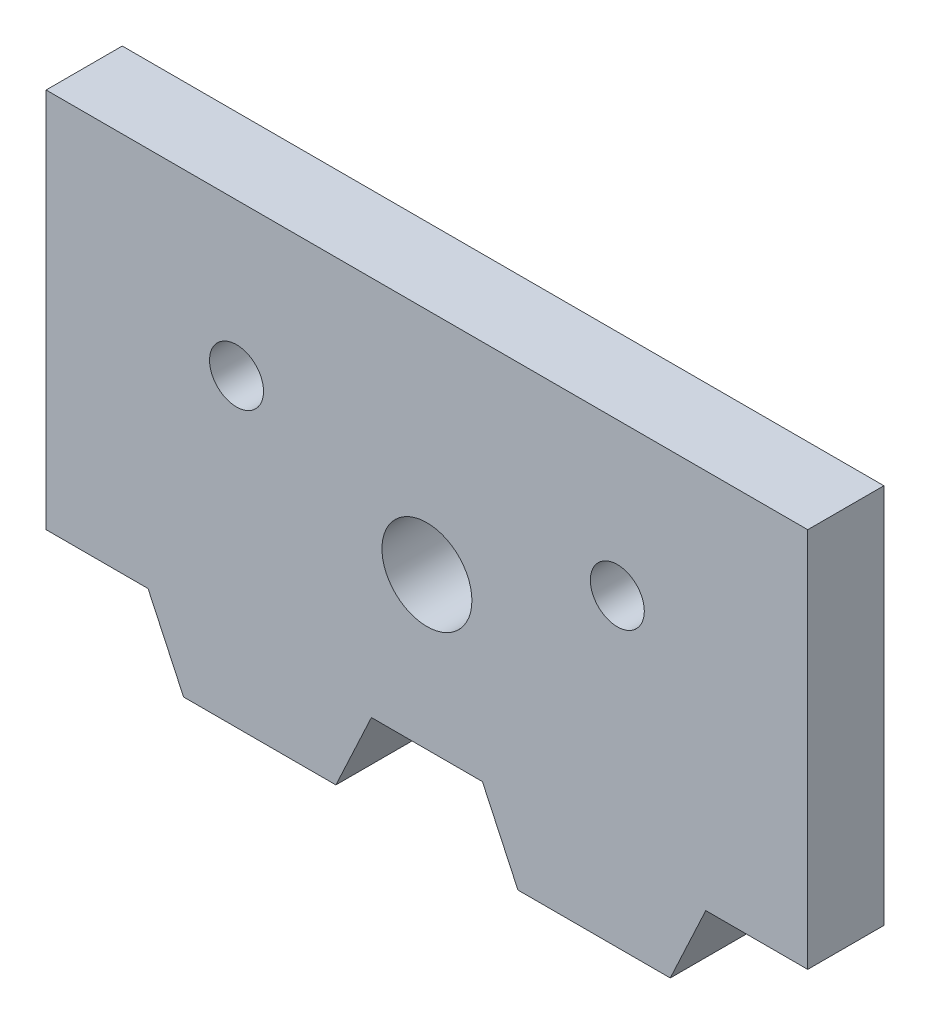
ISO-10303-21;
HEADER;
FILE_DESCRIPTION(('STEP AP214'),'2;1');
FILE_NAME('part.step','',(''),(''),'','','');
FILE_SCHEMA(('AUTOMOTIVE_DESIGN { 1 0 10303 214 1 1 1 1 }'));
ENDSEC;
DATA;
#1=APPLICATION_CONTEXT('core data for automotive mechanical design processes');
#2=APPLICATION_PROTOCOL_DEFINITION('international standard','automotive_design',2000,#1);
#3=PRODUCT_CONTEXT('',#1,'mechanical');
#4=PRODUCT('Part','Part','',(#3));
#5=PRODUCT_RELATED_PRODUCT_CATEGORY('part','',(#4));
#6=PRODUCT_DEFINITION_FORMATION('','',#4);
#7=PRODUCT_DEFINITION_CONTEXT('part definition',#1,'design');
#8=PRODUCT_DEFINITION('design','',#6,#7);
#9=PRODUCT_DEFINITION_SHAPE('','',#8);
#10=(LENGTH_UNIT() NAMED_UNIT(*) SI_UNIT(.MILLI.,.METRE.));
#11=(NAMED_UNIT(*) PLANE_ANGLE_UNIT() SI_UNIT($,.RADIAN.));
#12=(NAMED_UNIT(*) SI_UNIT($,.STERADIAN.) SOLID_ANGLE_UNIT());
#13=UNCERTAINTY_MEASURE_WITH_UNIT(LENGTH_MEASURE(1.E-05),#10,'distance_accuracy_value','');
#14=(GEOMETRIC_REPRESENTATION_CONTEXT(3) GLOBAL_UNCERTAINTY_ASSIGNED_CONTEXT((#13)) GLOBAL_UNIT_ASSIGNED_CONTEXT((#10,
#11,#12)) REPRESENTATION_CONTEXT('',''));
#15=CARTESIAN_POINT('',(0.,0.,0.));
#16=DIRECTION('',(0.,0.,1.));
#17=DIRECTION('',(1.,0.,0.));
#18=AXIS2_PLACEMENT_3D('',#15,#16,#17);
#19=CARTESIAN_POINT('',(47.8715159382446,-22.3228544894929,12.7));
#20=DIRECTION('',(0.906307787036647,-0.422618261740705,0.));
#21=DIRECTION('',(0.422618261740705,0.906307787036647,0.));
#22=AXIS2_PLACEMENT_3D('',#19,#20,#21);
#23=PLANE('',#22);
#24=DIRECTION('',(-0.422618261740705,-0.906307787036648,0.));
#25=VECTOR('',#24,1.);
#26=CARTESIAN_POINT('',(47.8715159382446,-22.3228544894929,0.));
#27=LINE('',#26,#25);
#28=CARTESIAN_POINT('',(46.5000000000001,-25.2640799106475,0.));
#29=VERTEX_POINT('',#28);
#30=CARTESIAN_POINT('',(40.5778927414315,-37.9640799106474,0.));
#31=VERTEX_POINT('',#30);
#32=EDGE_CURVE('E164',#29,#31,#27,.T.);
#33=ORIENTED_EDGE('',*,*,#32,.F.);
#34=DIRECTION('',(0.,0.,-1.));
#35=VECTOR('',#34,1.);
#36=CARTESIAN_POINT('',(46.5000000000001,-25.2640799106475,12.7));
#37=LINE('',#36,#35);
#38=CARTESIAN_POINT('',(46.5000000000001,-25.2640799106475,12.7));
#39=VERTEX_POINT('',#38);
#40=EDGE_CURVE('E11',#39,#29,#37,.T.);
#41=ORIENTED_EDGE('',*,*,#40,.F.);
#42=DIRECTION('',(-0.422618261740705,-0.906307787036648,0.));
#43=VECTOR('',#42,1.);
#44=CARTESIAN_POINT('',(47.8715159382446,-22.3228544894929,12.7));
#45=LINE('',#44,#43);
#46=CARTESIAN_POINT('',(40.5778927414315,-37.9640799106474,12.7));
#47=VERTEX_POINT('',#46);
#48=EDGE_CURVE('E202',#39,#47,#45,.T.);
#49=ORIENTED_EDGE('',*,*,#48,.T.);
#50=DIRECTION('',(0.,0.,-1.));
#51=VECTOR('',#50,1.);
#52=CARTESIAN_POINT('',(40.5778927414315,-37.9640799106474,12.7));
#53=LINE('',#52,#51);
#54=EDGE_CURVE('E97',#47,#31,#53,.T.);
#55=ORIENTED_EDGE('',*,*,#54,.T.);
#56=EDGE_LOOP('',(#33,#41,#49,#55));
#57=FACE_BOUND('',#56,.T.);
#58=ADVANCED_FACE('F35',(#57),#23,.T.);
#59=CARTESIAN_POINT('',(0.,-25.2640799106475,12.7));
#60=DIRECTION('',(0.,1.,0.));
#61=DIRECTION('',(-1.,0.,0.));
#62=AXIS2_PLACEMENT_3D('',#59,#60,#61);
#63=PLANE('',#62);
#64=DIRECTION('',(1.,0.,0.));
#65=VECTOR('',#64,1.);
#66=CARTESIAN_POINT('',(0.,-25.2640799106475,0.));
#67=LINE('',#66,#65);
#68=CARTESIAN_POINT('',(63.5000000000001,-25.2640799106475,0.));
#69=VERTEX_POINT('',#68);
#70=EDGE_CURVE('E167',#29,#69,#67,.T.);
#71=ORIENTED_EDGE('',*,*,#70,.T.);
#72=DIRECTION('',(0.,0.,-1.));
#73=VECTOR('',#72,1.);
#74=CARTESIAN_POINT('',(63.5000000000001,-25.2640799106475,12.7));
#75=LINE('',#74,#73);
#76=CARTESIAN_POINT('',(63.5000000000001,-25.2640799106475,12.7));
#77=VERTEX_POINT('',#76);
#78=EDGE_CURVE('E43',#77,#69,#75,.T.);
#79=ORIENTED_EDGE('',*,*,#78,.F.);
#80=DIRECTION('',(1.,0.,0.));
#81=VECTOR('',#80,1.);
#82=CARTESIAN_POINT('',(0.,-25.2640799106475,12.7));
#83=LINE('',#82,#81);
#84=EDGE_CURVE('E245',#39,#77,#83,.T.);
#85=ORIENTED_EDGE('',*,*,#84,.F.);
#86=ORIENTED_EDGE('',*,*,#40,.T.);
#87=EDGE_LOOP('',(#71,#79,#85,#86));
#88=FACE_BOUND('',#87,.T.);
#89=ADVANCED_FACE('F264',(#88),#63,.F.);
#90=CARTESIAN_POINT('',(63.5,0.,12.7));
#91=DIRECTION('',(-1.,0.,0.));
#92=DIRECTION('',(0.,-1.,0.));
#93=AXIS2_PLACEMENT_3D('',#90,#91,#92);
#94=PLANE('',#93);
#95=DIRECTION('',(0.,1.,0.));
#96=VECTOR('',#95,1.);
#97=CARTESIAN_POINT('',(63.5,0.,0.));
#98=LINE('',#97,#96);
#99=CARTESIAN_POINT('',(63.5,38.2359200893526,0.));
#100=VERTEX_POINT('',#99);
#101=EDGE_CURVE('E169',#69,#100,#98,.T.);
#102=ORIENTED_EDGE('',*,*,#101,.T.);
#103=DIRECTION('',(0.,0.,-1.));
#104=VECTOR('',#103,1.);
#105=CARTESIAN_POINT('',(63.5,38.2359200893526,12.7));
#106=LINE('',#105,#104);
#107=CARTESIAN_POINT('',(63.5,38.2359200893526,12.7));
#108=VERTEX_POINT('',#107);
#109=EDGE_CURVE('E217',#108,#100,#106,.T.);
#110=ORIENTED_EDGE('',*,*,#109,.F.);
#111=DIRECTION('',(0.,1.,0.));
#112=VECTOR('',#111,1.);
#113=CARTESIAN_POINT('',(63.5,0.,12.7));
#114=LINE('',#113,#112);
#115=EDGE_CURVE('E225',#77,#108,#114,.T.);
#116=ORIENTED_EDGE('',*,*,#115,.F.);
#117=ORIENTED_EDGE('',*,*,#78,.T.);
#118=EDGE_LOOP('',(#102,#110,#116,#117));
#119=FACE_BOUND('',#118,.T.);
#120=ADVANCED_FACE('F223',(#119),#94,.F.);
#121=CARTESIAN_POINT('',(0.,38.2359200893526,12.7));
#122=DIRECTION('',(0.,1.,0.));
#123=DIRECTION('',(0.,0.,1.));
#124=AXIS2_PLACEMENT_3D('',#121,#122,#123);
#125=PLANE('',#124);
#126=DIRECTION('',(1.,0.,0.));
#127=VECTOR('',#126,1.);
#128=CARTESIAN_POINT('',(0.,38.2359200893526,0.));
#129=LINE('',#128,#127);
#130=CARTESIAN_POINT('',(-63.5,38.2359200893526,0.));
#131=VERTEX_POINT('',#130);
#132=EDGE_CURVE('E172',#131,#100,#129,.T.);
#133=ORIENTED_EDGE('',*,*,#132,.F.);
#134=DIRECTION('',(0.,0.,-1.));
#135=VECTOR('',#134,1.);
#136=CARTESIAN_POINT('',(-63.5,38.2359200893526,12.7));
#137=LINE('',#136,#135);
#138=CARTESIAN_POINT('',(-63.5,38.2359200893526,12.7));
#139=VERTEX_POINT('',#138);
#140=EDGE_CURVE('E215',#139,#131,#137,.T.);
#141=ORIENTED_EDGE('',*,*,#140,.F.);
#142=DIRECTION('',(1.,0.,0.));
#143=VECTOR('',#142,1.);
#144=CARTESIAN_POINT('',(0.,38.2359200893526,12.7));
#145=LINE('',#144,#143);
#146=EDGE_CURVE('E238',#139,#108,#145,.T.);
#147=ORIENTED_EDGE('',*,*,#146,.T.);
#148=ORIENTED_EDGE('',*,*,#109,.T.);
#149=EDGE_LOOP('',(#133,#141,#147,#148));
#150=FACE_BOUND('',#149,.T.);
#151=ADVANCED_FACE('F235',(#150),#125,.T.);
#152=CARTESIAN_POINT('',(-63.5,0.,12.7));
#153=DIRECTION('',(-1.,0.,0.));
#154=DIRECTION('',(0.,-1.,0.));
#155=AXIS2_PLACEMENT_3D('',#152,#153,#154);
#156=PLANE('',#155);
#157=DIRECTION('',(0.,1.,0.));
#158=VECTOR('',#157,1.);
#159=CARTESIAN_POINT('',(-63.5,0.,0.));
#160=LINE('',#159,#158);
#161=CARTESIAN_POINT('',(-63.5,-25.2640799106475,0.));
#162=VERTEX_POINT('',#161);
#163=EDGE_CURVE('E175',#162,#131,#160,.T.);
#164=ORIENTED_EDGE('',*,*,#163,.F.);
#165=DIRECTION('',(0.,0.,-1.));
#166=VECTOR('',#165,1.);
#167=CARTESIAN_POINT('',(-63.5,-25.2640799106475,12.7));
#168=LINE('',#167,#166);
#169=CARTESIAN_POINT('',(-63.5,-25.2640799106475,12.7));
#170=VERTEX_POINT('',#169);
#171=EDGE_CURVE('E213',#170,#162,#168,.T.);
#172=ORIENTED_EDGE('',*,*,#171,.F.);
#173=DIRECTION('',(0.,1.,0.));
#174=VECTOR('',#173,1.);
#175=CARTESIAN_POINT('',(-63.5,0.,12.7));
#176=LINE('',#175,#174);
#177=EDGE_CURVE('E241',#170,#139,#176,.T.);
#178=ORIENTED_EDGE('',*,*,#177,.T.);
#179=ORIENTED_EDGE('',*,*,#140,.T.);
#180=EDGE_LOOP('',(#164,#172,#178,#179));
#181=FACE_BOUND('',#180,.T.);
#182=ADVANCED_FACE('F274',(#181),#156,.T.);
#183=CARTESIAN_POINT('',(0.,-25.2640799106475,12.7));
#184=DIRECTION('',(0.,1.,0.));
#185=DIRECTION('',(-1.,0.,0.));
#186=AXIS2_PLACEMENT_3D('',#183,#184,#185);
#187=PLANE('',#186);
#188=DIRECTION('',(1.,0.,0.));
#189=VECTOR('',#188,1.);
#190=CARTESIAN_POINT('',(0.,-25.2640799106475,0.));
#191=LINE('',#190,#189);
#192=CARTESIAN_POINT('',(-46.5,-25.2640799106475,0.));
#193=VERTEX_POINT('',#192);
#194=EDGE_CURVE('E178',#162,#193,#191,.T.);
#195=ORIENTED_EDGE('',*,*,#194,.T.);
#196=DIRECTION('',(0.,0.,-1.));
#197=VECTOR('',#196,1.);
#198=CARTESIAN_POINT('',(-46.5,-25.2640799106475,12.7));
#199=LINE('',#198,#197);
#200=CARTESIAN_POINT('',(-46.5,-25.2640799106475,12.7));
#201=VERTEX_POINT('',#200);
#202=EDGE_CURVE('E210',#201,#193,#199,.T.);
#203=ORIENTED_EDGE('',*,*,#202,.F.);
#204=DIRECTION('',(1.,0.,0.));
#205=VECTOR('',#204,1.);
#206=CARTESIAN_POINT('',(0.,-25.2640799106475,12.7));
#207=LINE('',#206,#205);
#208=EDGE_CURVE('E243',#170,#201,#207,.T.);
#209=ORIENTED_EDGE('',*,*,#208,.F.);
#210=ORIENTED_EDGE('',*,*,#171,.T.);
#211=EDGE_LOOP('',(#195,#203,#209,#210));
#212=FACE_BOUND('',#211,.T.);
#213=ADVANCED_FACE('F277',(#212),#187,.F.);
#214=CARTESIAN_POINT('',(-47.8715159382446,-22.3228544894928,12.7));
#215=DIRECTION('',(0.906307787036648,0.422618261740703,0.));
#216=DIRECTION('',(-0.422618261740703,0.906307787036648,0.));
#217=AXIS2_PLACEMENT_3D('',#214,#215,#216);
#218=PLANE('',#217);
#219=DIRECTION('',(0.422618261740703,-0.906307787036648,0.));
#220=VECTOR('',#219,1.);
#221=CARTESIAN_POINT('',(-47.8715159382446,-22.3228544894928,0.));
#222=LINE('',#221,#220);
#223=CARTESIAN_POINT('',(-40.5778927414315,-37.9640799106475,0.));
#224=VERTEX_POINT('',#223);
#225=EDGE_CURVE('E180',#193,#224,#222,.T.);
#226=ORIENTED_EDGE('',*,*,#225,.T.);
#227=DIRECTION('',(0.,0.,-1.));
#228=VECTOR('',#227,1.);
#229=CARTESIAN_POINT('',(-40.5778927414315,-37.9640799106475,12.7));
#230=LINE('',#229,#228);
#231=CARTESIAN_POINT('',(-40.5778927414315,-37.9640799106475,12.7));
#232=VERTEX_POINT('',#231);
#233=EDGE_CURVE('E208',#232,#224,#230,.T.);
#234=ORIENTED_EDGE('',*,*,#233,.F.);
#235=DIRECTION('',(0.422618261740703,-0.906307787036648,0.));
#236=VECTOR('',#235,1.);
#237=CARTESIAN_POINT('',(-47.8715159382446,-22.3228544894928,12.7));
#238=LINE('',#237,#236);
#239=EDGE_CURVE('E250',#201,#232,#238,.T.);
#240=ORIENTED_EDGE('',*,*,#239,.F.);
#241=ORIENTED_EDGE('',*,*,#202,.T.);
#242=EDGE_LOOP('',(#226,#234,#240,#241));
#243=FACE_BOUND('',#242,.T.);
#244=ADVANCED_FACE('F281',(#243),#218,.F.);
#245=CARTESIAN_POINT('',(0.,-37.9640799106474,12.7));
#246=DIRECTION('',(0.,-1.,0.));
#247=DIRECTION('',(0.,0.,-1.));
#248=AXIS2_PLACEMENT_3D('',#245,#246,#247);
#249=PLANE('',#248);
#250=DIRECTION('',(-1.,0.,0.));
#251=VECTOR('',#250,1.);
#252=CARTESIAN_POINT('',(0.,-37.9640799106474,0.));
#253=LINE('',#252,#251);
#254=CARTESIAN_POINT('',(-15.1778927414315,-37.9640799106474,0.));
#255=VERTEX_POINT('',#254);
#256=EDGE_CURVE('E183',#255,#224,#253,.T.);
#257=ORIENTED_EDGE('',*,*,#256,.F.);
#258=DIRECTION('',(0.,0.,-1.));
#259=VECTOR('',#258,1.);
#260=CARTESIAN_POINT('',(-15.1778927414315,-37.9640799106474,12.7));
#261=LINE('',#260,#259);
#262=CARTESIAN_POINT('',(-15.1778927414315,-37.9640799106474,12.7));
#263=VERTEX_POINT('',#262);
#264=EDGE_CURVE('E206',#263,#255,#261,.T.);
#265=ORIENTED_EDGE('',*,*,#264,.F.);
#266=DIRECTION('',(-1.,0.,0.));
#267=VECTOR('',#266,1.);
#268=CARTESIAN_POINT('',(0.,-37.9640799106474,12.7));
#269=LINE('',#268,#267);
#270=EDGE_CURVE('E150',#263,#232,#269,.T.);
#271=ORIENTED_EDGE('',*,*,#270,.T.);
#272=ORIENTED_EDGE('',*,*,#233,.T.);
#273=EDGE_LOOP('',(#257,#265,#271,#272));
#274=FACE_BOUND('',#273,.T.);
#275=ADVANCED_FACE('F254',(#274),#249,.T.);
#276=CARTESIAN_POINT('',(2.0740591584506,-0.967149669052021,12.7));
#277=DIRECTION('',(0.906307787036651,-0.422618261740697,0.));
#278=DIRECTION('',(0.422618261740697,0.906307787036651,0.));
#279=AXIS2_PLACEMENT_3D('',#276,#277,#278);
#280=PLANE('',#279);
#281=DIRECTION('',(-0.422618261740697,-0.906307787036651,0.));
#282=VECTOR('',#281,1.);
#283=CARTESIAN_POINT('',(2.0740591584506,-0.967149669052021,0.));
#284=LINE('',#283,#282);
#285=CARTESIAN_POINT('',(-9.25578548286305,-25.2640799106475,0.));
#286=VERTEX_POINT('',#285);
#287=EDGE_CURVE('E186',#286,#255,#284,.T.);
#288=ORIENTED_EDGE('',*,*,#287,.F.);
#289=DIRECTION('',(0.,0.,-1.));
#290=VECTOR('',#289,1.);
#291=CARTESIAN_POINT('',(-9.25578548286305,-25.2640799106475,12.7));
#292=LINE('',#291,#290);
#293=CARTESIAN_POINT('',(-9.25578548286305,-25.2640799106475,12.7));
#294=VERTEX_POINT('',#293);
#295=EDGE_CURVE('E137',#294,#286,#292,.T.);
#296=ORIENTED_EDGE('',*,*,#295,.F.);
#297=DIRECTION('',(-0.422618261740697,-0.906307787036651,0.));
#298=VECTOR('',#297,1.);
#299=CARTESIAN_POINT('',(2.0740591584506,-0.967149669052021,12.7));
#300=LINE('',#299,#298);
#301=EDGE_CURVE('E148',#294,#263,#300,.T.);
#302=ORIENTED_EDGE('',*,*,#301,.T.);
#303=ORIENTED_EDGE('',*,*,#264,.T.);
#304=EDGE_LOOP('',(#288,#296,#302,#303));
#305=FACE_BOUND('',#304,.T.);
#306=ADVANCED_FACE('F259',(#305),#280,.T.);
#307=CARTESIAN_POINT('',(0.,-25.2640799106475,12.7));
#308=DIRECTION('',(0.,-1.,0.));
#309=DIRECTION('',(0.,0.,-1.));
#310=AXIS2_PLACEMENT_3D('',#307,#308,#309);
#311=PLANE('',#310);
#312=DIRECTION('',(-1.,0.,0.));
#313=VECTOR('',#312,1.);
#314=CARTESIAN_POINT('',(0.,-25.2640799106475,0.));
#315=LINE('',#314,#313);
#316=CARTESIAN_POINT('',(9.25578548286305,-25.2640799106475,0.));
#317=VERTEX_POINT('',#316);
#318=EDGE_CURVE('E136',#317,#286,#315,.T.);
#319=ORIENTED_EDGE('',*,*,#318,.F.);
#320=DIRECTION('',(0.,0.,-1.));
#321=VECTOR('',#320,1.);
#322=CARTESIAN_POINT('',(9.25578548286305,-25.2640799106475,12.7));
#323=LINE('',#322,#321);
#324=CARTESIAN_POINT('',(9.25578548286305,-25.2640799106475,12.7));
#325=VERTEX_POINT('',#324);
#326=EDGE_CURVE('E130',#325,#317,#323,.T.);
#327=ORIENTED_EDGE('',*,*,#326,.F.);
#328=DIRECTION('',(-1.,0.,0.));
#329=VECTOR('',#328,1.);
#330=CARTESIAN_POINT('',(0.,-25.2640799106475,12.7));
#331=LINE('',#330,#329);
#332=EDGE_CURVE('E134',#325,#294,#331,.T.);
#333=ORIENTED_EDGE('',*,*,#332,.T.);
#334=ORIENTED_EDGE('',*,*,#295,.T.);
#335=EDGE_LOOP('',(#319,#327,#333,#334));
#336=FACE_BOUND('',#335,.T.);
#337=ADVANCED_FACE('F132',(#336),#311,.T.);
#338=CARTESIAN_POINT('',(-2.0740591584506,-0.967149669052021,12.7));
#339=DIRECTION('',(0.906307787036651,0.422618261740697,0.));
#340=DIRECTION('',(-0.422618261740697,0.906307787036651,0.));
#341=AXIS2_PLACEMENT_3D('',#338,#339,#340);
#342=PLANE('',#341);
#343=DIRECTION('',(0.422618261740697,-0.906307787036651,0.));
#344=VECTOR('',#343,1.);
#345=CARTESIAN_POINT('',(-2.0740591584506,-0.967149669052021,0.));
#346=LINE('',#345,#344);
#347=CARTESIAN_POINT('',(15.1778927414315,-37.9640799106474,0.));
#348=VERTEX_POINT('',#347);
#349=EDGE_CURVE('E90',#317,#348,#346,.T.);
#350=ORIENTED_EDGE('',*,*,#349,.T.);
#351=DIRECTION('',(0.,0.,-1.));
#352=VECTOR('',#351,1.);
#353=CARTESIAN_POINT('',(15.1778927414315,-37.9640799106474,12.7));
#354=LINE('',#353,#352);
#355=CARTESIAN_POINT('',(15.1778927414315,-37.9640799106474,12.7));
#356=VERTEX_POINT('',#355);
#357=EDGE_CURVE('E138',#356,#348,#354,.T.);
#358=ORIENTED_EDGE('',*,*,#357,.F.);
#359=DIRECTION('',(0.422618261740697,-0.906307787036651,0.));
#360=VECTOR('',#359,1.);
#361=CARTESIAN_POINT('',(-2.0740591584506,-0.967149669052021,12.7));
#362=LINE('',#361,#360);
#363=EDGE_CURVE('E140',#325,#356,#362,.T.);
#364=ORIENTED_EDGE('',*,*,#363,.F.);
#365=ORIENTED_EDGE('',*,*,#326,.T.);
#366=EDGE_LOOP('',(#350,#358,#364,#365));
#367=FACE_BOUND('',#366,.T.);
#368=ADVANCED_FACE('F141',(#367),#342,.F.);
#369=CARTESIAN_POINT('',(31.75,12.8359200893526,12.7));
#370=DIRECTION('',(0.,0.,-1.));
#371=DIRECTION('',(-1.,0.,0.));
#372=AXIS2_PLACEMENT_3D('',#369,#370,#371);
#373=CYLINDRICAL_SURFACE('',#372,4.5);
#374=CARTESIAN_POINT('',(31.75,12.8359200893526,12.7));
#375=DIRECTION('',(0.,0.,1.));
#376=DIRECTION('',(1.,0.,0.));
#377=AXIS2_PLACEMENT_3D('',#374,#375,#376);
#378=CIRCLE('',#377,4.5);
#379=CARTESIAN_POINT('',(36.25,12.8359200893526,12.7));
#380=VERTEX_POINT('',#379);
#381=EDGE_CURVE('E158',#380,#380,#378,.T.);
#382=ORIENTED_EDGE('',*,*,#381,.T.);
#383=EDGE_LOOP('',(#382));
#384=FACE_BOUND('',#383,.T.);
#385=CARTESIAN_POINT('',(31.75,12.8359200893526,0.));
#386=DIRECTION('',(0.,0.,1.));
#387=DIRECTION('',(1.,0.,0.));
#388=AXIS2_PLACEMENT_3D('',#385,#386,#387);
#389=CIRCLE('',#388,4.5);
#390=CARTESIAN_POINT('',(36.25,12.8359200893526,0.));
#391=VERTEX_POINT('',#390);
#392=EDGE_CURVE('E196',#391,#391,#389,.T.);
#393=ORIENTED_EDGE('',*,*,#392,.F.);
#394=EDGE_LOOP('',(#393));
#395=FACE_BOUND('',#394,.T.);
#396=ADVANCED_FACE('F294',(#384,#395),#373,.F.);
#397=CARTESIAN_POINT('',(0.,0.,12.7));
#398=DIRECTION('',(0.,0.,-1.));
#399=DIRECTION('',(-1.,0.,0.));
#400=AXIS2_PLACEMENT_3D('',#397,#398,#399);
#401=CYLINDRICAL_SURFACE('',#400,7.5);
#402=CARTESIAN_POINT('',(0.,0.,12.7));
#403=DIRECTION('',(0.,0.,1.));
#404=DIRECTION('',(1.,0.,0.));
#405=AXIS2_PLACEMENT_3D('',#402,#403,#404);
#406=CIRCLE('',#405,7.5);
#407=CARTESIAN_POINT('',(7.5,0.,12.7));
#408=VERTEX_POINT('',#407);
#409=EDGE_CURVE('E155',#408,#408,#406,.T.);
#410=ORIENTED_EDGE('',*,*,#409,.T.);
#411=EDGE_LOOP('',(#410));
#412=FACE_BOUND('',#411,.T.);
#413=CARTESIAN_POINT('',(0.,0.,0.));
#414=DIRECTION('',(0.,0.,1.));
#415=DIRECTION('',(1.,0.,0.));
#416=AXIS2_PLACEMENT_3D('',#413,#414,#415);
#417=CIRCLE('',#416,7.5);
#418=CARTESIAN_POINT('',(7.5,0.,0.));
#419=VERTEX_POINT('',#418);
#420=EDGE_CURVE('E193',#419,#419,#417,.T.);
#421=ORIENTED_EDGE('',*,*,#420,.F.);
#422=EDGE_LOOP('',(#421));
#423=FACE_BOUND('',#422,.T.);
#424=ADVANCED_FACE('F298',(#412,#423),#401,.F.);
#425=CARTESIAN_POINT('',(0.,-37.9640799106474,12.7));
#426=DIRECTION('',(0.,1.,0.));
#427=DIRECTION('',(0.,0.,1.));
#428=AXIS2_PLACEMENT_3D('',#425,#426,#427);
#429=PLANE('',#428);
#430=DIRECTION('',(1.,0.,0.));
#431=VECTOR('',#430,1.);
#432=CARTESIAN_POINT('',(0.,-37.9640799106474,0.));
#433=LINE('',#432,#431);
#434=EDGE_CURVE('E191',#348,#31,#433,.T.);
#435=ORIENTED_EDGE('',*,*,#434,.T.);
#436=ORIENTED_EDGE('',*,*,#54,.F.);
#437=DIRECTION('',(1.,0.,0.));
#438=VECTOR('',#437,1.);
#439=CARTESIAN_POINT('',(0.,-37.9640799106474,12.7));
#440=LINE('',#439,#438);
#441=EDGE_CURVE('E51',#356,#47,#440,.T.);
#442=ORIENTED_EDGE('',*,*,#441,.F.);
#443=ORIENTED_EDGE('',*,*,#357,.T.);
#444=EDGE_LOOP('',(#435,#436,#442,#443));
#445=FACE_BOUND('',#444,.T.);
#446=ADVANCED_FACE('F262',(#445),#429,.F.);
#447=CARTESIAN_POINT('',(-31.75,12.8359200893526,12.7));
#448=DIRECTION('',(0.,0.,-1.));
#449=DIRECTION('',(-1.,0.,0.));
#450=AXIS2_PLACEMENT_3D('',#447,#448,#449);
#451=CYLINDRICAL_SURFACE('',#450,4.5);
#452=CARTESIAN_POINT('',(-31.75,12.8359200893526,12.7));
#453=DIRECTION('',(0.,0.,1.));
#454=DIRECTION('',(1.,0.,0.));
#455=AXIS2_PLACEMENT_3D('',#452,#453,#454);
#456=CIRCLE('',#455,4.5);
#457=CARTESIAN_POINT('',(-27.25,12.8359200893526,12.7));
#458=VERTEX_POINT('',#457);
#459=EDGE_CURVE('E161',#458,#458,#456,.F.);
#460=ORIENTED_EDGE('',*,*,#459,.F.);
#461=EDGE_LOOP('',(#460));
#462=FACE_BOUND('',#461,.T.);
#463=CARTESIAN_POINT('',(-31.75,12.8359200893526,0.));
#464=DIRECTION('',(0.,0.,1.));
#465=DIRECTION('',(1.,0.,0.));
#466=AXIS2_PLACEMENT_3D('',#463,#464,#465);
#467=CIRCLE('',#466,4.5);
#468=CARTESIAN_POINT('',(-27.25,12.8359200893526,0.));
#469=VERTEX_POINT('',#468);
#470=EDGE_CURVE('E199',#469,#469,#467,.F.);
#471=ORIENTED_EDGE('',*,*,#470,.T.);
#472=EDGE_LOOP('',(#471));
#473=FACE_BOUND('',#472,.T.);
#474=ADVANCED_FACE('F297',(#462,#473),#451,.F.);
#475=CARTESIAN_POINT('',(0.,0.,12.7));
#476=DIRECTION('',(0.,0.,1.));
#477=DIRECTION('',(1.,0.,0.));
#478=AXIS2_PLACEMENT_3D('',#475,#476,#477);
#479=PLANE('',#478);
#480=ORIENTED_EDGE('',*,*,#48,.F.);
#481=ORIENTED_EDGE('',*,*,#84,.T.);
#482=ORIENTED_EDGE('',*,*,#115,.T.);
#483=ORIENTED_EDGE('',*,*,#146,.F.);
#484=ORIENTED_EDGE('',*,*,#177,.F.);
#485=ORIENTED_EDGE('',*,*,#208,.T.);
#486=ORIENTED_EDGE('',*,*,#239,.T.);
#487=ORIENTED_EDGE('',*,*,#270,.F.);
#488=ORIENTED_EDGE('',*,*,#301,.F.);
#489=ORIENTED_EDGE('',*,*,#332,.F.);
#490=ORIENTED_EDGE('',*,*,#363,.T.);
#491=ORIENTED_EDGE('',*,*,#441,.T.);
#492=EDGE_LOOP('',(#480,#481,#482,#483,#484,#485,#486,#487,#488,#489,#490,#491));
#493=FACE_BOUND('',#492,.T.);
#494=ORIENTED_EDGE('',*,*,#409,.F.);
#495=EDGE_LOOP('',(#494));
#496=FACE_BOUND('',#495,.T.);
#497=ORIENTED_EDGE('',*,*,#381,.F.);
#498=EDGE_LOOP('',(#497));
#499=FACE_BOUND('',#498,.T.);
#500=ORIENTED_EDGE('',*,*,#459,.T.);
#501=EDGE_LOOP('',(#500));
#502=FACE_BOUND('',#501,.T.);
#503=ADVANCED_FACE('F144',(#493,#496,#499,#502),#479,.T.);
#504=CARTESIAN_POINT('',(0.,0.,0.));
#505=DIRECTION('',(0.,0.,1.));
#506=DIRECTION('',(1.,0.,0.));
#507=AXIS2_PLACEMENT_3D('',#504,#505,#506);
#508=PLANE('',#507);
#509=ORIENTED_EDGE('',*,*,#32,.T.);
#510=ORIENTED_EDGE('',*,*,#434,.F.);
#511=ORIENTED_EDGE('',*,*,#349,.F.);
#512=ORIENTED_EDGE('',*,*,#318,.T.);
#513=ORIENTED_EDGE('',*,*,#287,.T.);
#514=ORIENTED_EDGE('',*,*,#256,.T.);
#515=ORIENTED_EDGE('',*,*,#225,.F.);
#516=ORIENTED_EDGE('',*,*,#194,.F.);
#517=ORIENTED_EDGE('',*,*,#163,.T.);
#518=ORIENTED_EDGE('',*,*,#132,.T.);
#519=ORIENTED_EDGE('',*,*,#101,.F.);
#520=ORIENTED_EDGE('',*,*,#70,.F.);
#521=EDGE_LOOP('',(#509,#510,#511,#512,#513,#514,#515,#516,#517,#518,#519,#520));
#522=FACE_BOUND('',#521,.T.);
#523=ORIENTED_EDGE('',*,*,#420,.T.);
#524=EDGE_LOOP('',(#523));
#525=FACE_BOUND('',#524,.T.);
#526=ORIENTED_EDGE('',*,*,#392,.T.);
#527=EDGE_LOOP('',(#526));
#528=FACE_BOUND('',#527,.T.);
#529=ORIENTED_EDGE('',*,*,#470,.F.);
#530=EDGE_LOOP('',(#529));
#531=FACE_BOUND('',#530,.T.);
#532=ADVANCED_FACE('F229',(#522,#525,#528,#531),#508,.F.);
#533=CLOSED_SHELL('',(#58,#89,#120,#151,#182,#213,#244,#275,#306,#337,#368,#396,#424,#446,#474,
#503,#532));
#534=MANIFOLD_SOLID_BREP('B2',#533);
#535=ADVANCED_BREP_SHAPE_REPRESENTATION('',(#18,#534),#14);
#536=SHAPE_DEFINITION_REPRESENTATION(#9,#535);
ENDSEC;
END-ISO-10303-21;
